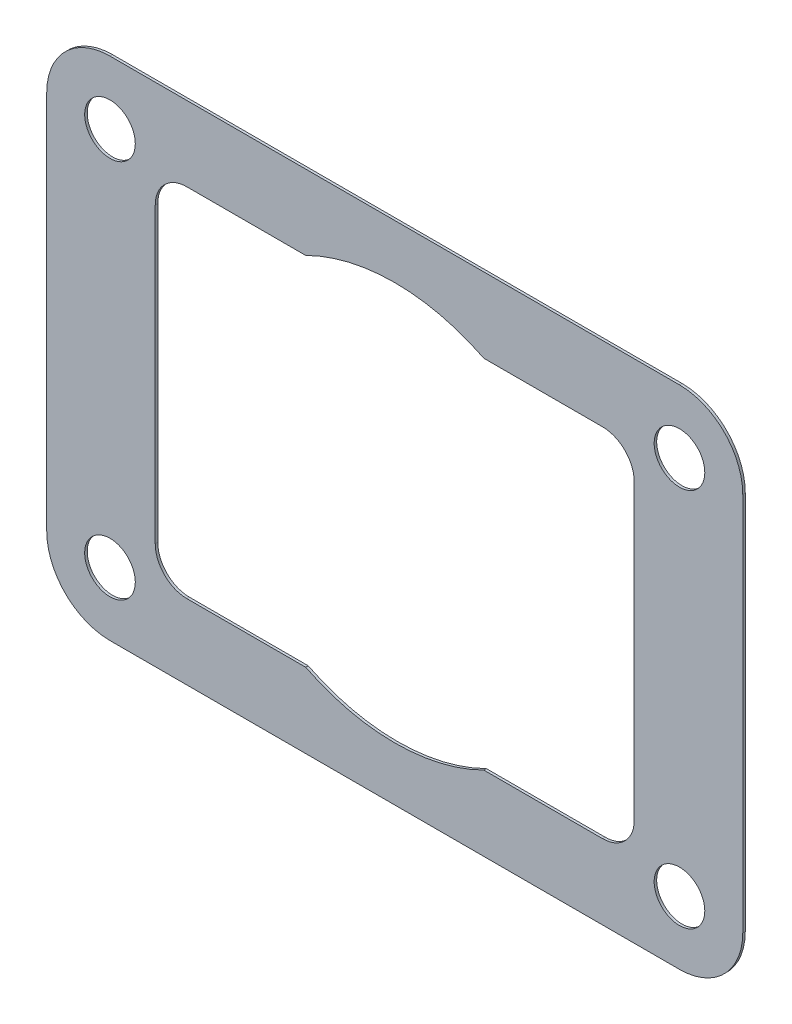
ISO-10303-21;
HEADER;
FILE_DESCRIPTION(('STEP AP214'),'2;1');
FILE_NAME('part.step','',(''),(''),'','','');
FILE_SCHEMA(('AUTOMOTIVE_DESIGN { 1 0 10303 214 1 1 1 1 }'));
ENDSEC;
DATA;
#1=APPLICATION_CONTEXT('core data for automotive mechanical design processes');
#2=APPLICATION_PROTOCOL_DEFINITION('international standard','automotive_design',2000,#1);
#3=PRODUCT_CONTEXT('',#1,'mechanical');
#4=PRODUCT('Part','Part','',(#3));
#5=PRODUCT_RELATED_PRODUCT_CATEGORY('part','',(#4));
#6=PRODUCT_DEFINITION_FORMATION('','',#4);
#7=PRODUCT_DEFINITION_CONTEXT('part definition',#1,'design');
#8=PRODUCT_DEFINITION('design','',#6,#7);
#9=PRODUCT_DEFINITION_SHAPE('','',#8);
#10=(LENGTH_UNIT() NAMED_UNIT(*) SI_UNIT(.MILLI.,.METRE.));
#11=(NAMED_UNIT(*) PLANE_ANGLE_UNIT() SI_UNIT($,.RADIAN.));
#12=(NAMED_UNIT(*) SI_UNIT($,.STERADIAN.) SOLID_ANGLE_UNIT());
#13=UNCERTAINTY_MEASURE_WITH_UNIT(LENGTH_MEASURE(1.E-05),#10,'distance_accuracy_value','');
#14=(GEOMETRIC_REPRESENTATION_CONTEXT(3) GLOBAL_UNCERTAINTY_ASSIGNED_CONTEXT((#13)) GLOBAL_UNIT_ASSIGNED_CONTEXT((#10,
#11,#12)) REPRESENTATION_CONTEXT('',''));
#15=CARTESIAN_POINT('',(0.,0.,0.));
#16=DIRECTION('',(0.,0.,1.));
#17=DIRECTION('',(1.,0.,0.));
#18=AXIS2_PLACEMENT_3D('',#15,#16,#17);
#19=CARTESIAN_POINT('',(-57.15,-38.1,0.508));
#20=DIRECTION('',(0.,0.,-1.));
#21=DIRECTION('',(-1.,0.,0.));
#22=AXIS2_PLACEMENT_3D('',#19,#20,#21);
#23=PLANE('',#22);
#24=CARTESIAN_POINT('',(57.15,38.1,0.508));
#25=DIRECTION('',(0.,0.,1.));
#26=DIRECTION('',(1.,0.,0.));
#27=AXIS2_PLACEMENT_3D('',#24,#25,#26);
#28=CIRCLE('',#27,5.08000000000001);
#29=CARTESIAN_POINT('',(62.23,38.1,0.508));
#30=VERTEX_POINT('',#29);
#31=EDGE_CURVE('E262',#30,#30,#28,.T.);
#32=ORIENTED_EDGE('',*,*,#31,.F.);
#33=EDGE_LOOP('',(#32));
#34=FACE_BOUND('',#33,.T.);
#35=CARTESIAN_POINT('',(-57.15,-38.1,0.508));
#36=DIRECTION('',(0.,0.,1.));
#37=DIRECTION('',(1.,0.,0.));
#38=AXIS2_PLACEMENT_3D('',#35,#36,#37);
#39=CIRCLE('',#38,5.08000000000001);
#40=CARTESIAN_POINT('',(-52.07,-38.1,0.508));
#41=VERTEX_POINT('',#40);
#42=EDGE_CURVE('E274',#41,#41,#39,.T.);
#43=ORIENTED_EDGE('',*,*,#42,.F.);
#44=EDGE_LOOP('',(#43));
#45=FACE_BOUND('',#44,.T.);
#46=CARTESIAN_POINT('',(-57.15,-38.1,0.508));
#47=DIRECTION('',(0.,0.,1.));
#48=DIRECTION('',(-1.,0.,0.));
#49=AXIS2_PLACEMENT_3D('',#46,#47,#48);
#50=CIRCLE('',#49,12.7);
#51=CARTESIAN_POINT('',(-69.85,-38.1,0.508));
#52=VERTEX_POINT('',#51);
#53=CARTESIAN_POINT('',(-57.15,-50.8,0.508));
#54=VERTEX_POINT('',#53);
#55=EDGE_CURVE('E286',#52,#54,#50,.T.);
#56=ORIENTED_EDGE('',*,*,#55,.T.);
#57=DIRECTION('',(1.,0.,0.));
#58=VECTOR('',#57,1.);
#59=CARTESIAN_POINT('',(-57.15,-50.8,0.508));
#60=LINE('',#59,#58);
#61=CARTESIAN_POINT('',(57.15,-50.8,0.508));
#62=VERTEX_POINT('',#61);
#63=EDGE_CURVE('E289',#54,#62,#60,.T.);
#64=ORIENTED_EDGE('',*,*,#63,.T.);
#65=CARTESIAN_POINT('',(57.15,-38.1,0.508));
#66=DIRECTION('',(0.,0.,1.));
#67=DIRECTION('',(1.,0.,0.));
#68=AXIS2_PLACEMENT_3D('',#65,#66,#67);
#69=CIRCLE('',#68,12.7);
#70=CARTESIAN_POINT('',(69.85,-38.1,0.508));
#71=VERTEX_POINT('',#70);
#72=EDGE_CURVE('E292',#62,#71,#69,.T.);
#73=ORIENTED_EDGE('',*,*,#72,.T.);
#74=DIRECTION('',(0.,1.,0.));
#75=VECTOR('',#74,1.);
#76=CARTESIAN_POINT('',(69.85,-38.1,0.508));
#77=LINE('',#76,#75);
#78=CARTESIAN_POINT('',(69.85,38.1,0.508));
#79=VERTEX_POINT('',#78);
#80=EDGE_CURVE('E294',#71,#79,#77,.T.);
#81=ORIENTED_EDGE('',*,*,#80,.T.);
#82=CARTESIAN_POINT('',(57.15,38.1,0.508));
#83=DIRECTION('',(0.,0.,1.));
#84=DIRECTION('',(-1.,0.,0.));
#85=AXIS2_PLACEMENT_3D('',#82,#83,#84);
#86=CIRCLE('',#85,12.7);
#87=CARTESIAN_POINT('',(57.15,50.8,0.508));
#88=VERTEX_POINT('',#87);
#89=EDGE_CURVE('E296',#79,#88,#86,.T.);
#90=ORIENTED_EDGE('',*,*,#89,.T.);
#91=DIRECTION('',(-1.,0.,0.));
#92=VECTOR('',#91,1.);
#93=CARTESIAN_POINT('',(-57.15,50.8,0.508));
#94=LINE('',#93,#92);
#95=CARTESIAN_POINT('',(-57.15,50.8,0.508));
#96=VERTEX_POINT('',#95);
#97=EDGE_CURVE('E298',#88,#96,#94,.T.);
#98=ORIENTED_EDGE('',*,*,#97,.T.);
#99=CARTESIAN_POINT('',(-57.15,38.1,0.508));
#100=DIRECTION('',(0.,0.,1.));
#101=DIRECTION('',(-1.,0.,0.));
#102=AXIS2_PLACEMENT_3D('',#99,#100,#101);
#103=CIRCLE('',#102,12.7);
#104=CARTESIAN_POINT('',(-69.85,38.1,0.508));
#105=VERTEX_POINT('',#104);
#106=EDGE_CURVE('E300',#96,#105,#103,.T.);
#107=ORIENTED_EDGE('',*,*,#106,.T.);
#108=DIRECTION('',(0.,-1.,0.));
#109=VECTOR('',#108,1.);
#110=CARTESIAN_POINT('',(-69.85,-38.1,0.508));
#111=LINE('',#110,#109);
#112=EDGE_CURVE('E302',#105,#52,#111,.T.);
#113=ORIENTED_EDGE('',*,*,#112,.T.);
#114=EDGE_LOOP('',(#56,#64,#73,#81,#90,#98,#107,#113));
#115=FACE_BOUND('',#114,.T.);
#116=CARTESIAN_POINT('',(-57.15,38.1,0.508));
#117=DIRECTION('',(0.,0.,1.));
#118=DIRECTION('',(1.,0.,0.));
#119=AXIS2_PLACEMENT_3D('',#116,#117,#118);
#120=CIRCLE('',#119,5.08000000000001);
#121=CARTESIAN_POINT('',(-52.07,38.1,0.508));
#122=VERTEX_POINT('',#121);
#123=EDGE_CURVE('E280',#122,#122,#120,.T.);
#124=ORIENTED_EDGE('',*,*,#123,.F.);
#125=EDGE_LOOP('',(#124));
#126=FACE_BOUND('',#125,.T.);
#127=CARTESIAN_POINT('',(57.15,-38.1,0.508));
#128=DIRECTION('',(0.,0.,1.));
#129=DIRECTION('',(1.,0.,0.));
#130=AXIS2_PLACEMENT_3D('',#127,#128,#129);
#131=CIRCLE('',#130,5.08000000000001);
#132=CARTESIAN_POINT('',(62.23,-38.1,0.508));
#133=VERTEX_POINT('',#132);
#134=EDGE_CURVE('E268',#133,#133,#131,.T.);
#135=ORIENTED_EDGE('',*,*,#134,.F.);
#136=EDGE_LOOP('',(#135));
#137=FACE_BOUND('',#136,.T.);
#138=CARTESIAN_POINT('',(41.7195,29.4386,0.508));
#139=DIRECTION('',(0.,0.,1.));
#140=DIRECTION('',(-1.,0.,0.));
#141=AXIS2_PLACEMENT_3D('',#138,#139,#140);
#142=CIRCLE('',#141,6.35);
#143=CARTESIAN_POINT('',(48.0695,29.4386,0.508));
#144=VERTEX_POINT('',#143);
#145=CARTESIAN_POINT('',(41.7195,35.7886,0.508));
#146=VERTEX_POINT('',#145);
#147=EDGE_CURVE('E169',#144,#146,#142,.T.);
#148=ORIENTED_EDGE('',*,*,#147,.F.);
#149=DIRECTION('',(0.,1.,0.));
#150=VECTOR('',#149,1.);
#151=CARTESIAN_POINT('',(48.0695,-29.4385999999999,0.508));
#152=LINE('',#151,#150);
#153=CARTESIAN_POINT('',(48.0695,-29.4385999999999,0.508));
#154=VERTEX_POINT('',#153);
#155=EDGE_CURVE('E210',#154,#144,#152,.T.);
#156=ORIENTED_EDGE('',*,*,#155,.F.);
#157=CARTESIAN_POINT('',(41.7195,-29.4386,0.508));
#158=DIRECTION('',(0.,0.,1.));
#159=DIRECTION('',(1.,0.,0.));
#160=AXIS2_PLACEMENT_3D('',#157,#158,#159);
#161=CIRCLE('',#160,6.35);
#162=CARTESIAN_POINT('',(41.7195,-35.7886,0.508));
#163=VERTEX_POINT('',#162);
#164=EDGE_CURVE('E208',#163,#154,#161,.T.);
#165=ORIENTED_EDGE('',*,*,#164,.F.);
#166=DIRECTION('',(1.,0.,0.));
#167=VECTOR('',#166,1.);
#168=CARTESIAN_POINT('',(17.8766925084033,-35.7886,0.508));
#169=LINE('',#168,#167);
#170=CARTESIAN_POINT('',(17.8766925084033,-35.7886,0.508));
#171=VERTEX_POINT('',#170);
#172=EDGE_CURVE('E206',#171,#163,#169,.T.);
#173=ORIENTED_EDGE('',*,*,#172,.F.);
#174=CARTESIAN_POINT('',(0.,0.,0.508));
#175=DIRECTION('',(0.,0.,1.));
#176=DIRECTION('',(1.,0.,0.));
#177=AXIS2_PLACEMENT_3D('',#174,#175,#176);
#178=CIRCLE('',#177,40.005);
#179=CARTESIAN_POINT('',(-17.8766925084033,-35.7886,0.508));
#180=VERTEX_POINT('',#179);
#181=EDGE_CURVE('E204',#180,#171,#178,.T.);
#182=ORIENTED_EDGE('',*,*,#181,.F.);
#183=DIRECTION('',(1.,0.,0.));
#184=VECTOR('',#183,1.);
#185=CARTESIAN_POINT('',(-41.7194999999999,-35.7886,0.508));
#186=LINE('',#185,#184);
#187=CARTESIAN_POINT('',(-41.7194999999999,-35.7886,0.508));
#188=VERTEX_POINT('',#187);
#189=EDGE_CURVE('E202',#188,#180,#186,.T.);
#190=ORIENTED_EDGE('',*,*,#189,.F.);
#191=CARTESIAN_POINT('',(-41.7195,-29.4386,0.508));
#192=DIRECTION('',(0.,0.,1.));
#193=DIRECTION('',(-1.,0.,0.));
#194=AXIS2_PLACEMENT_3D('',#191,#192,#193);
#195=CIRCLE('',#194,6.35);
#196=CARTESIAN_POINT('',(-48.0695,-29.4385999999999,0.508));
#197=VERTEX_POINT('',#196);
#198=EDGE_CURVE('E200',#197,#188,#195,.T.);
#199=ORIENTED_EDGE('',*,*,#198,.F.);
#200=DIRECTION('',(0.,-1.,0.));
#201=VECTOR('',#200,1.);
#202=CARTESIAN_POINT('',(-48.0695,-29.4385999999999,0.508));
#203=LINE('',#202,#201);
#204=CARTESIAN_POINT('',(-48.0695,29.4386,0.508));
#205=VERTEX_POINT('',#204);
#206=EDGE_CURVE('E198',#205,#197,#203,.T.);
#207=ORIENTED_EDGE('',*,*,#206,.F.);
#208=CARTESIAN_POINT('',(-41.7195,29.4386,0.508));
#209=DIRECTION('',(0.,0.,1.));
#210=DIRECTION('',(-1.,0.,0.));
#211=AXIS2_PLACEMENT_3D('',#208,#209,#210);
#212=CIRCLE('',#211,6.35);
#213=CARTESIAN_POINT('',(-41.7194999999999,35.7886,0.508));
#214=VERTEX_POINT('',#213);
#215=EDGE_CURVE('E196',#214,#205,#212,.T.);
#216=ORIENTED_EDGE('',*,*,#215,.F.);
#217=DIRECTION('',(-1.,0.,0.));
#218=VECTOR('',#217,1.);
#219=CARTESIAN_POINT('',(-41.7194999999999,35.7886,0.508));
#220=LINE('',#219,#218);
#221=CARTESIAN_POINT('',(-17.8766925084032,35.7886,0.508));
#222=VERTEX_POINT('',#221);
#223=EDGE_CURVE('E192',#222,#214,#220,.T.);
#224=ORIENTED_EDGE('',*,*,#223,.F.);
#225=CARTESIAN_POINT('',(0.,0.,0.508));
#226=DIRECTION('',(0.,0.,1.));
#227=DIRECTION('',(1.,0.,0.));
#228=AXIS2_PLACEMENT_3D('',#225,#226,#227);
#229=CIRCLE('',#228,40.005);
#230=CARTESIAN_POINT('',(17.8766925084032,35.7886,0.508));
#231=VERTEX_POINT('',#230);
#232=EDGE_CURVE('E190',#231,#222,#229,.T.);
#233=ORIENTED_EDGE('',*,*,#232,.F.);
#234=DIRECTION('',(-1.,0.,0.));
#235=VECTOR('',#234,1.);
#236=CARTESIAN_POINT('',(17.8766925084032,35.7886,0.508));
#237=LINE('',#236,#235);
#238=EDGE_CURVE('E177',#146,#231,#237,.T.);
#239=ORIENTED_EDGE('',*,*,#238,.F.);
#240=EDGE_LOOP('',(#148,#156,#165,#173,#182,#190,#199,#207,#216,#224,#233,#239));
#241=FACE_BOUND('',#240,.T.);
#242=ADVANCED_FACE('F32',(#34,#45,#115,#126,#137,#241),#23,.F.);
#243=CARTESIAN_POINT('',(-57.15,-38.1,0.));
#244=DIRECTION('',(0.,0.,-1.));
#245=DIRECTION('',(-1.,0.,0.));
#246=AXIS2_PLACEMENT_3D('',#243,#244,#245);
#247=PLANE('',#246);
#248=CARTESIAN_POINT('',(57.15,38.1,0.));
#249=DIRECTION('',(0.,0.,1.));
#250=DIRECTION('',(1.,0.,0.));
#251=AXIS2_PLACEMENT_3D('',#248,#249,#250);
#252=CIRCLE('',#251,5.08000000000001);
#253=CARTESIAN_POINT('',(62.23,38.1,0.));
#254=VERTEX_POINT('',#253);
#255=EDGE_CURVE('E185',#254,#254,#252,.T.);
#256=ORIENTED_EDGE('',*,*,#255,.T.);
#257=EDGE_LOOP('',(#256));
#258=FACE_BOUND('',#257,.T.);
#259=CARTESIAN_POINT('',(-57.15,-38.1,0.));
#260=DIRECTION('',(0.,0.,1.));
#261=DIRECTION('',(1.,0.,0.));
#262=AXIS2_PLACEMENT_3D('',#259,#260,#261);
#263=CIRCLE('',#262,5.08000000000001);
#264=CARTESIAN_POINT('',(-52.07,-38.1,0.));
#265=VERTEX_POINT('',#264);
#266=EDGE_CURVE('E271',#265,#265,#263,.T.);
#267=ORIENTED_EDGE('',*,*,#266,.T.);
#268=EDGE_LOOP('',(#267));
#269=FACE_BOUND('',#268,.T.);
#270=CARTESIAN_POINT('',(-57.15,-38.1,0.));
#271=DIRECTION('',(0.,0.,1.));
#272=DIRECTION('',(-1.,0.,0.));
#273=AXIS2_PLACEMENT_3D('',#270,#271,#272);
#274=CIRCLE('',#273,12.7);
#275=CARTESIAN_POINT('',(-69.85,-38.1,0.));
#276=VERTEX_POINT('',#275);
#277=CARTESIAN_POINT('',(-57.15,-50.8,0.));
#278=VERTEX_POINT('',#277);
#279=EDGE_CURVE('E283',#276,#278,#274,.T.);
#280=ORIENTED_EDGE('',*,*,#279,.F.);
#281=DIRECTION('',(0.,-1.,0.));
#282=VECTOR('',#281,1.);
#283=CARTESIAN_POINT('',(-69.85,-38.1,0.));
#284=LINE('',#283,#282);
#285=CARTESIAN_POINT('',(-69.85,38.1,0.));
#286=VERTEX_POINT('',#285);
#287=EDGE_CURVE('E290',#286,#276,#284,.T.);
#288=ORIENTED_EDGE('',*,*,#287,.F.);
#289=CARTESIAN_POINT('',(-57.15,38.1,0.));
#290=DIRECTION('',(0.,0.,1.));
#291=DIRECTION('',(-1.,0.,0.));
#292=AXIS2_PLACEMENT_3D('',#289,#290,#291);
#293=CIRCLE('',#292,12.7);
#294=CARTESIAN_POINT('',(-57.15,50.8,0.));
#295=VERTEX_POINT('',#294);
#296=EDGE_CURVE('E317',#295,#286,#293,.T.);
#297=ORIENTED_EDGE('',*,*,#296,.F.);
#298=DIRECTION('',(-1.,0.,0.));
#299=VECTOR('',#298,1.);
#300=CARTESIAN_POINT('',(-57.15,50.8,0.));
#301=LINE('',#300,#299);
#302=CARTESIAN_POINT('',(57.15,50.8,0.));
#303=VERTEX_POINT('',#302);
#304=EDGE_CURVE('E315',#303,#295,#301,.T.);
#305=ORIENTED_EDGE('',*,*,#304,.F.);
#306=CARTESIAN_POINT('',(57.15,38.1,0.));
#307=DIRECTION('',(0.,0.,1.));
#308=DIRECTION('',(-1.,0.,0.));
#309=AXIS2_PLACEMENT_3D('',#306,#307,#308);
#310=CIRCLE('',#309,12.7);
#311=CARTESIAN_POINT('',(69.85,38.1,0.));
#312=VERTEX_POINT('',#311);
#313=EDGE_CURVE('E313',#312,#303,#310,.T.);
#314=ORIENTED_EDGE('',*,*,#313,.F.);
#315=DIRECTION('',(0.,1.,0.));
#316=VECTOR('',#315,1.);
#317=CARTESIAN_POINT('',(69.85,-38.1,0.));
#318=LINE('',#317,#316);
#319=CARTESIAN_POINT('',(69.85,-38.1,0.));
#320=VERTEX_POINT('',#319);
#321=EDGE_CURVE('E311',#320,#312,#318,.T.);
#322=ORIENTED_EDGE('',*,*,#321,.F.);
#323=CARTESIAN_POINT('',(57.15,-38.1,0.));
#324=DIRECTION('',(0.,0.,1.));
#325=DIRECTION('',(1.,0.,0.));
#326=AXIS2_PLACEMENT_3D('',#323,#324,#325);
#327=CIRCLE('',#326,12.7);
#328=CARTESIAN_POINT('',(57.15,-50.8,0.));
#329=VERTEX_POINT('',#328);
#330=EDGE_CURVE('E309',#329,#320,#327,.T.);
#331=ORIENTED_EDGE('',*,*,#330,.F.);
#332=DIRECTION('',(1.,0.,0.));
#333=VECTOR('',#332,1.);
#334=CARTESIAN_POINT('',(-57.15,-50.8,0.));
#335=LINE('',#334,#333);
#336=EDGE_CURVE('E307',#278,#329,#335,.T.);
#337=ORIENTED_EDGE('',*,*,#336,.F.);
#338=EDGE_LOOP('',(#280,#288,#297,#305,#314,#322,#331,#337));
#339=FACE_BOUND('',#338,.T.);
#340=CARTESIAN_POINT('',(-57.15,38.1,0.));
#341=DIRECTION('',(0.,0.,1.));
#342=DIRECTION('',(1.,0.,0.));
#343=AXIS2_PLACEMENT_3D('',#340,#341,#342);
#344=CIRCLE('',#343,5.08000000000001);
#345=CARTESIAN_POINT('',(-52.07,38.1,0.));
#346=VERTEX_POINT('',#345);
#347=EDGE_CURVE('E277',#346,#346,#344,.T.);
#348=ORIENTED_EDGE('',*,*,#347,.T.);
#349=EDGE_LOOP('',(#348));
#350=FACE_BOUND('',#349,.T.);
#351=CARTESIAN_POINT('',(57.15,-38.1,0.));
#352=DIRECTION('',(0.,0.,1.));
#353=DIRECTION('',(1.,0.,0.));
#354=AXIS2_PLACEMENT_3D('',#351,#352,#353);
#355=CIRCLE('',#354,5.08000000000001);
#356=CARTESIAN_POINT('',(62.23,-38.1,0.));
#357=VERTEX_POINT('',#356);
#358=EDGE_CURVE('E265',#357,#357,#355,.T.);
#359=ORIENTED_EDGE('',*,*,#358,.T.);
#360=EDGE_LOOP('',(#359));
#361=FACE_BOUND('',#360,.T.);
#362=DIRECTION('',(0.,1.,0.));
#363=VECTOR('',#362,1.);
#364=CARTESIAN_POINT('',(48.0695,-29.4385999999999,0.));
#365=LINE('',#364,#363);
#366=CARTESIAN_POINT('',(48.0695,-29.4385999999999,0.));
#367=VERTEX_POINT('',#366);
#368=CARTESIAN_POINT('',(48.0695,29.4386,0.));
#369=VERTEX_POINT('',#368);
#370=EDGE_CURVE('E178',#367,#369,#365,.T.);
#371=ORIENTED_EDGE('',*,*,#370,.T.);
#372=CARTESIAN_POINT('',(41.7195,29.4386,0.));
#373=DIRECTION('',(0.,0.,1.));
#374=DIRECTION('',(-1.,0.,0.));
#375=AXIS2_PLACEMENT_3D('',#372,#373,#374);
#376=CIRCLE('',#375,6.35);
#377=CARTESIAN_POINT('',(41.7195,35.7886,0.));
#378=VERTEX_POINT('',#377);
#379=EDGE_CURVE('E55',#369,#378,#376,.T.);
#380=ORIENTED_EDGE('',*,*,#379,.T.);
#381=DIRECTION('',(-1.,0.,0.));
#382=VECTOR('',#381,1.);
#383=CARTESIAN_POINT('',(17.8766925084032,35.7886,0.));
#384=LINE('',#383,#382);
#385=CARTESIAN_POINT('',(17.8766925084032,35.7886,0.));
#386=VERTEX_POINT('',#385);
#387=EDGE_CURVE('E184',#378,#386,#384,.T.);
#388=ORIENTED_EDGE('',*,*,#387,.T.);
#389=CARTESIAN_POINT('',(0.,0.,0.));
#390=DIRECTION('',(0.,0.,1.));
#391=DIRECTION('',(1.,0.,0.));
#392=AXIS2_PLACEMENT_3D('',#389,#390,#391);
#393=CIRCLE('',#392,40.005);
#394=CARTESIAN_POINT('',(-17.8766925084032,35.7886,0.));
#395=VERTEX_POINT('',#394);
#396=EDGE_CURVE('E214',#386,#395,#393,.T.);
#397=ORIENTED_EDGE('',*,*,#396,.T.);
#398=DIRECTION('',(-1.,0.,0.));
#399=VECTOR('',#398,1.);
#400=CARTESIAN_POINT('',(-41.7194999999999,35.7886,0.));
#401=LINE('',#400,#399);
#402=CARTESIAN_POINT('',(-41.7194999999999,35.7886,0.));
#403=VERTEX_POINT('',#402);
#404=EDGE_CURVE('E217',#395,#403,#401,.T.);
#405=ORIENTED_EDGE('',*,*,#404,.T.);
#406=CARTESIAN_POINT('',(-41.7195,29.4386,0.));
#407=DIRECTION('',(0.,0.,1.));
#408=DIRECTION('',(-1.,0.,0.));
#409=AXIS2_PLACEMENT_3D('',#406,#407,#408);
#410=CIRCLE('',#409,6.35);
#411=CARTESIAN_POINT('',(-48.0695,29.4386,0.));
#412=VERTEX_POINT('',#411);
#413=EDGE_CURVE('E220',#403,#412,#410,.T.);
#414=ORIENTED_EDGE('',*,*,#413,.T.);
#415=DIRECTION('',(0.,-1.,0.));
#416=VECTOR('',#415,1.);
#417=CARTESIAN_POINT('',(-48.0695,-29.4385999999999,0.));
#418=LINE('',#417,#416);
#419=CARTESIAN_POINT('',(-48.0695,-29.4385999999999,0.));
#420=VERTEX_POINT('',#419);
#421=EDGE_CURVE('E223',#412,#420,#418,.T.);
#422=ORIENTED_EDGE('',*,*,#421,.T.);
#423=CARTESIAN_POINT('',(-41.7195,-29.4386,0.));
#424=DIRECTION('',(0.,0.,1.));
#425=DIRECTION('',(-1.,0.,0.));
#426=AXIS2_PLACEMENT_3D('',#423,#424,#425);
#427=CIRCLE('',#426,6.35);
#428=CARTESIAN_POINT('',(-41.7194999999999,-35.7886,0.));
#429=VERTEX_POINT('',#428);
#430=EDGE_CURVE('E226',#420,#429,#427,.T.);
#431=ORIENTED_EDGE('',*,*,#430,.T.);
#432=DIRECTION('',(1.,0.,0.));
#433=VECTOR('',#432,1.);
#434=CARTESIAN_POINT('',(-41.7194999999999,-35.7886,0.));
#435=LINE('',#434,#433);
#436=CARTESIAN_POINT('',(-17.8766925084033,-35.7886,0.));
#437=VERTEX_POINT('',#436);
#438=EDGE_CURVE('E229',#429,#437,#435,.T.);
#439=ORIENTED_EDGE('',*,*,#438,.T.);
#440=CARTESIAN_POINT('',(0.,0.,0.));
#441=DIRECTION('',(0.,0.,1.));
#442=DIRECTION('',(1.,0.,0.));
#443=AXIS2_PLACEMENT_3D('',#440,#441,#442);
#444=CIRCLE('',#443,40.005);
#445=CARTESIAN_POINT('',(17.8766925084033,-35.7886,0.));
#446=VERTEX_POINT('',#445);
#447=EDGE_CURVE('E232',#437,#446,#444,.T.);
#448=ORIENTED_EDGE('',*,*,#447,.T.);
#449=DIRECTION('',(1.,0.,0.));
#450=VECTOR('',#449,1.);
#451=CARTESIAN_POINT('',(17.8766925084033,-35.7886,0.));
#452=LINE('',#451,#450);
#453=CARTESIAN_POINT('',(41.7195,-35.7886,0.));
#454=VERTEX_POINT('',#453);
#455=EDGE_CURVE('E235',#446,#454,#452,.T.);
#456=ORIENTED_EDGE('',*,*,#455,.T.);
#457=CARTESIAN_POINT('',(41.7195,-29.4386,0.));
#458=DIRECTION('',(0.,0.,1.));
#459=DIRECTION('',(1.,0.,0.));
#460=AXIS2_PLACEMENT_3D('',#457,#458,#459);
#461=CIRCLE('',#460,6.35);
#462=EDGE_CURVE('E238',#454,#367,#461,.T.);
#463=ORIENTED_EDGE('',*,*,#462,.T.);
#464=EDGE_LOOP('',(#371,#380,#388,#397,#405,#414,#422,#431,#439,#448,#456,#463));
#465=FACE_BOUND('',#464,.T.);
#466=ADVANCED_FACE('F347',(#258,#269,#339,#350,#361,#465),#247,.T.);
#467=CARTESIAN_POINT('',(-57.15,-38.1,0.508));
#468=DIRECTION('',(0.,0.,-1.));
#469=DIRECTION('',(-1.,0.,0.));
#470=AXIS2_PLACEMENT_3D('',#467,#468,#469);
#471=CYLINDRICAL_SURFACE('',#470,12.7);
#472=ORIENTED_EDGE('',*,*,#279,.T.);
#473=DIRECTION('',(0.,0.,-1.));
#474=VECTOR('',#473,1.);
#475=CARTESIAN_POINT('',(-57.15,-50.8,0.508));
#476=LINE('',#475,#474);
#477=EDGE_CURVE('E11',#54,#278,#476,.T.);
#478=ORIENTED_EDGE('',*,*,#477,.F.);
#479=ORIENTED_EDGE('',*,*,#55,.F.);
#480=DIRECTION('',(0.,0.,-1.));
#481=VECTOR('',#480,1.);
#482=CARTESIAN_POINT('',(-69.85,-38.1,0.508));
#483=LINE('',#482,#481);
#484=EDGE_CURVE('E304',#52,#276,#483,.T.);
#485=ORIENTED_EDGE('',*,*,#484,.T.);
#486=EDGE_LOOP('',(#472,#478,#479,#485));
#487=FACE_BOUND('',#486,.T.);
#488=ADVANCED_FACE('F34',(#487),#471,.T.);
#489=CARTESIAN_POINT('',(-57.15,-50.8,0.508));
#490=DIRECTION('',(0.,1.,0.));
#491=DIRECTION('',(0.,0.,1.));
#492=AXIS2_PLACEMENT_3D('',#489,#490,#491);
#493=PLANE('',#492);
#494=ORIENTED_EDGE('',*,*,#336,.T.);
#495=DIRECTION('',(0.,0.,-1.));
#496=VECTOR('',#495,1.);
#497=CARTESIAN_POINT('',(57.15,-50.8,0.508));
#498=LINE('',#497,#496);
#499=EDGE_CURVE('E40',#62,#329,#498,.T.);
#500=ORIENTED_EDGE('',*,*,#499,.F.);
#501=ORIENTED_EDGE('',*,*,#63,.F.);
#502=ORIENTED_EDGE('',*,*,#477,.T.);
#503=EDGE_LOOP('',(#494,#500,#501,#502));
#504=FACE_BOUND('',#503,.T.);
#505=ADVANCED_FACE('F365',(#504),#493,.F.);
#506=CARTESIAN_POINT('',(57.15,-38.1,0.508));
#507=DIRECTION('',(0.,0.,-1.));
#508=DIRECTION('',(-1.,0.,0.));
#509=AXIS2_PLACEMENT_3D('',#506,#507,#508);
#510=CYLINDRICAL_SURFACE('',#509,12.7);
#511=ORIENTED_EDGE('',*,*,#330,.T.);
#512=DIRECTION('',(0.,0.,-1.));
#513=VECTOR('',#512,1.);
#514=CARTESIAN_POINT('',(69.85,-38.1,0.508));
#515=LINE('',#514,#513);
#516=EDGE_CURVE('E334',#71,#320,#515,.T.);
#517=ORIENTED_EDGE('',*,*,#516,.F.);
#518=ORIENTED_EDGE('',*,*,#72,.F.);
#519=ORIENTED_EDGE('',*,*,#499,.T.);
#520=EDGE_LOOP('',(#511,#517,#518,#519));
#521=FACE_BOUND('',#520,.T.);
#522=ADVANCED_FACE('F341',(#521),#510,.T.);
#523=CARTESIAN_POINT('',(69.85,-38.1,0.508));
#524=DIRECTION('',(-1.,0.,0.));
#525=DIRECTION('',(0.,0.,1.));
#526=AXIS2_PLACEMENT_3D('',#523,#524,#525);
#527=PLANE('',#526);
#528=ORIENTED_EDGE('',*,*,#321,.T.);
#529=DIRECTION('',(0.,0.,-1.));
#530=VECTOR('',#529,1.);
#531=CARTESIAN_POINT('',(69.85,38.1,0.508));
#532=LINE('',#531,#530);
#533=EDGE_CURVE('E331',#79,#312,#532,.T.);
#534=ORIENTED_EDGE('',*,*,#533,.F.);
#535=ORIENTED_EDGE('',*,*,#80,.F.);
#536=ORIENTED_EDGE('',*,*,#516,.T.);
#537=EDGE_LOOP('',(#528,#534,#535,#536));
#538=FACE_BOUND('',#537,.T.);
#539=ADVANCED_FACE('F353',(#538),#527,.F.);
#540=CARTESIAN_POINT('',(57.15,38.1,0.508));
#541=DIRECTION('',(0.,0.,-1.));
#542=DIRECTION('',(-1.,0.,0.));
#543=AXIS2_PLACEMENT_3D('',#540,#541,#542);
#544=CYLINDRICAL_SURFACE('',#543,12.7);
#545=ORIENTED_EDGE('',*,*,#313,.T.);
#546=DIRECTION('',(0.,0.,-1.));
#547=VECTOR('',#546,1.);
#548=CARTESIAN_POINT('',(57.15,50.8,0.508));
#549=LINE('',#548,#547);
#550=EDGE_CURVE('E328',#88,#303,#549,.T.);
#551=ORIENTED_EDGE('',*,*,#550,.F.);
#552=ORIENTED_EDGE('',*,*,#89,.F.);
#553=ORIENTED_EDGE('',*,*,#533,.T.);
#554=EDGE_LOOP('',(#545,#551,#552,#553));
#555=FACE_BOUND('',#554,.T.);
#556=ADVANCED_FACE('F357',(#555),#544,.T.);
#557=CARTESIAN_POINT('',(-57.15,50.8,0.508));
#558=DIRECTION('',(0.,-1.,0.));
#559=DIRECTION('',(0.,0.,-1.));
#560=AXIS2_PLACEMENT_3D('',#557,#558,#559);
#561=PLANE('',#560);
#562=ORIENTED_EDGE('',*,*,#304,.T.);
#563=DIRECTION('',(0.,0.,-1.));
#564=VECTOR('',#563,1.);
#565=CARTESIAN_POINT('',(-57.15,50.8,0.508));
#566=LINE('',#565,#564);
#567=EDGE_CURVE('E325',#96,#295,#566,.T.);
#568=ORIENTED_EDGE('',*,*,#567,.F.);
#569=ORIENTED_EDGE('',*,*,#97,.F.);
#570=ORIENTED_EDGE('',*,*,#550,.T.);
#571=EDGE_LOOP('',(#562,#568,#569,#570));
#572=FACE_BOUND('',#571,.T.);
#573=ADVANCED_FACE('F378',(#572),#561,.F.);
#574=CARTESIAN_POINT('',(-57.15,38.1,0.508));
#575=DIRECTION('',(0.,0.,-1.));
#576=DIRECTION('',(-1.,0.,0.));
#577=AXIS2_PLACEMENT_3D('',#574,#575,#576);
#578=CYLINDRICAL_SURFACE('',#577,12.7);
#579=ORIENTED_EDGE('',*,*,#296,.T.);
#580=DIRECTION('',(0.,0.,-1.));
#581=VECTOR('',#580,1.);
#582=CARTESIAN_POINT('',(-69.85,38.1,0.508));
#583=LINE('',#582,#581);
#584=EDGE_CURVE('E322',#105,#286,#583,.T.);
#585=ORIENTED_EDGE('',*,*,#584,.F.);
#586=ORIENTED_EDGE('',*,*,#106,.F.);
#587=ORIENTED_EDGE('',*,*,#567,.T.);
#588=EDGE_LOOP('',(#579,#585,#586,#587));
#589=FACE_BOUND('',#588,.T.);
#590=ADVANCED_FACE('F376',(#589),#578,.T.);
#591=CARTESIAN_POINT('',(-69.85,-38.1,0.508));
#592=DIRECTION('',(1.,0.,0.));
#593=DIRECTION('',(0.,0.,-1.));
#594=AXIS2_PLACEMENT_3D('',#591,#592,#593);
#595=PLANE('',#594);
#596=ORIENTED_EDGE('',*,*,#287,.T.);
#597=ORIENTED_EDGE('',*,*,#484,.F.);
#598=ORIENTED_EDGE('',*,*,#112,.F.);
#599=ORIENTED_EDGE('',*,*,#584,.T.);
#600=EDGE_LOOP('',(#596,#597,#598,#599));
#601=FACE_BOUND('',#600,.T.);
#602=ADVANCED_FACE('F371',(#601),#595,.F.);
#603=CARTESIAN_POINT('',(-57.15,38.1,0.508));
#604=DIRECTION('',(0.,0.,-1.));
#605=DIRECTION('',(-1.,0.,0.));
#606=AXIS2_PLACEMENT_3D('',#603,#604,#605);
#607=CYLINDRICAL_SURFACE('',#606,5.08000000000001);
#608=ORIENTED_EDGE('',*,*,#123,.T.);
#609=EDGE_LOOP('',(#608));
#610=FACE_BOUND('',#609,.T.);
#611=ORIENTED_EDGE('',*,*,#347,.F.);
#612=EDGE_LOOP('',(#611));
#613=FACE_BOUND('',#612,.T.);
#614=ADVANCED_FACE('F398',(#610,#613),#607,.F.);
#615=CARTESIAN_POINT('',(-57.15,-38.1,0.508));
#616=DIRECTION('',(0.,0.,-1.));
#617=DIRECTION('',(-1.,0.,0.));
#618=AXIS2_PLACEMENT_3D('',#615,#616,#617);
#619=CYLINDRICAL_SURFACE('',#618,5.08000000000001);
#620=ORIENTED_EDGE('',*,*,#42,.T.);
#621=EDGE_LOOP('',(#620));
#622=FACE_BOUND('',#621,.T.);
#623=ORIENTED_EDGE('',*,*,#266,.F.);
#624=EDGE_LOOP('',(#623));
#625=FACE_BOUND('',#624,.T.);
#626=ADVANCED_FACE('F405',(#622,#625),#619,.F.);
#627=CARTESIAN_POINT('',(57.15,-38.1,0.508));
#628=DIRECTION('',(0.,0.,-1.));
#629=DIRECTION('',(-1.,0.,0.));
#630=AXIS2_PLACEMENT_3D('',#627,#628,#629);
#631=CYLINDRICAL_SURFACE('',#630,5.08000000000001);
#632=ORIENTED_EDGE('',*,*,#134,.T.);
#633=EDGE_LOOP('',(#632));
#634=FACE_BOUND('',#633,.T.);
#635=ORIENTED_EDGE('',*,*,#358,.F.);
#636=EDGE_LOOP('',(#635));
#637=FACE_BOUND('',#636,.T.);
#638=ADVANCED_FACE('F410',(#634,#637),#631,.F.);
#639=CARTESIAN_POINT('',(57.15,38.1,0.508));
#640=DIRECTION('',(0.,0.,-1.));
#641=DIRECTION('',(-1.,0.,0.));
#642=AXIS2_PLACEMENT_3D('',#639,#640,#641);
#643=CYLINDRICAL_SURFACE('',#642,5.08000000000001);
#644=ORIENTED_EDGE('',*,*,#31,.T.);
#645=EDGE_LOOP('',(#644));
#646=FACE_BOUND('',#645,.T.);
#647=ORIENTED_EDGE('',*,*,#255,.F.);
#648=EDGE_LOOP('',(#647));
#649=FACE_BOUND('',#648,.T.);
#650=ADVANCED_FACE('F473',(#646,#649),#643,.F.);
#651=CARTESIAN_POINT('',(41.7195,29.4386,0.508));
#652=DIRECTION('',(0.,0.,-1.));
#653=DIRECTION('',(-1.,0.,0.));
#654=AXIS2_PLACEMENT_3D('',#651,#652,#653);
#655=CYLINDRICAL_SURFACE('',#654,6.35);
#656=ORIENTED_EDGE('',*,*,#379,.F.);
#657=DIRECTION('',(0.,0.,-1.));
#658=VECTOR('',#657,1.);
#659=CARTESIAN_POINT('',(48.0695,29.4386,0.508));
#660=LINE('',#659,#658);
#661=EDGE_CURVE('E173',#144,#369,#660,.T.);
#662=ORIENTED_EDGE('',*,*,#661,.F.);
#663=ORIENTED_EDGE('',*,*,#147,.T.);
#664=DIRECTION('',(0.,0.,-1.));
#665=VECTOR('',#664,1.);
#666=CARTESIAN_POINT('',(41.7195,35.7886,0.508));
#667=LINE('',#666,#665);
#668=EDGE_CURVE('E172',#146,#378,#667,.T.);
#669=ORIENTED_EDGE('',*,*,#668,.T.);
#670=EDGE_LOOP('',(#656,#662,#663,#669));
#671=FACE_BOUND('',#670,.T.);
#672=ADVANCED_FACE('F171',(#671),#655,.F.);
#673=CARTESIAN_POINT('',(17.8766925084032,35.7886,0.508));
#674=DIRECTION('',(0.,-1.,0.));
#675=DIRECTION('',(0.,0.,-1.));
#676=AXIS2_PLACEMENT_3D('',#673,#674,#675);
#677=PLANE('',#676);
#678=ORIENTED_EDGE('',*,*,#387,.F.);
#679=ORIENTED_EDGE('',*,*,#668,.F.);
#680=ORIENTED_EDGE('',*,*,#238,.T.);
#681=DIRECTION('',(0.,0.,-1.));
#682=VECTOR('',#681,1.);
#683=CARTESIAN_POINT('',(17.8766925084032,35.7886,0.508));
#684=LINE('',#683,#682);
#685=EDGE_CURVE('E186',#231,#386,#684,.T.);
#686=ORIENTED_EDGE('',*,*,#685,.T.);
#687=EDGE_LOOP('',(#678,#679,#680,#686));
#688=FACE_BOUND('',#687,.T.);
#689=ADVANCED_FACE('F181',(#688),#677,.T.);
#690=CARTESIAN_POINT('',(0.,0.,0.508));
#691=DIRECTION('',(0.,0.,-1.));
#692=DIRECTION('',(-1.,0.,0.));
#693=AXIS2_PLACEMENT_3D('',#690,#691,#692);
#694=CYLINDRICAL_SURFACE('',#693,40.005);
#695=ORIENTED_EDGE('',*,*,#396,.F.);
#696=ORIENTED_EDGE('',*,*,#685,.F.);
#697=ORIENTED_EDGE('',*,*,#232,.T.);
#698=DIRECTION('',(0.,0.,-1.));
#699=VECTOR('',#698,1.);
#700=CARTESIAN_POINT('',(-17.8766925084032,35.7886,0.508));
#701=LINE('',#700,#699);
#702=EDGE_CURVE('E259',#222,#395,#701,.T.);
#703=ORIENTED_EDGE('',*,*,#702,.T.);
#704=EDGE_LOOP('',(#695,#696,#697,#703));
#705=FACE_BOUND('',#704,.T.);
#706=ADVANCED_FACE('F460',(#705),#694,.F.);
#707=CARTESIAN_POINT('',(-41.7194999999999,35.7886,0.508));
#708=DIRECTION('',(0.,-1.,0.));
#709=DIRECTION('',(0.,0.,-1.));
#710=AXIS2_PLACEMENT_3D('',#707,#708,#709);
#711=PLANE('',#710);
#712=ORIENTED_EDGE('',*,*,#404,.F.);
#713=ORIENTED_EDGE('',*,*,#702,.F.);
#714=ORIENTED_EDGE('',*,*,#223,.T.);
#715=DIRECTION('',(0.,0.,-1.));
#716=VECTOR('',#715,1.);
#717=CARTESIAN_POINT('',(-41.7194999999999,35.7886,0.508));
#718=LINE('',#717,#716);
#719=EDGE_CURVE('E257',#214,#403,#718,.T.);
#720=ORIENTED_EDGE('',*,*,#719,.T.);
#721=EDGE_LOOP('',(#712,#713,#714,#720));
#722=FACE_BOUND('',#721,.T.);
#723=ADVANCED_FACE('F456',(#722),#711,.T.);
#724=CARTESIAN_POINT('',(-41.7195,29.4386,0.508));
#725=DIRECTION('',(0.,0.,-1.));
#726=DIRECTION('',(-1.,0.,0.));
#727=AXIS2_PLACEMENT_3D('',#724,#725,#726);
#728=CYLINDRICAL_SURFACE('',#727,6.35);
#729=ORIENTED_EDGE('',*,*,#413,.F.);
#730=ORIENTED_EDGE('',*,*,#719,.F.);
#731=ORIENTED_EDGE('',*,*,#215,.T.);
#732=DIRECTION('',(0.,0.,-1.));
#733=VECTOR('',#732,1.);
#734=CARTESIAN_POINT('',(-48.0695,29.4386,0.508));
#735=LINE('',#734,#733);
#736=EDGE_CURVE('E255',#205,#412,#735,.T.);
#737=ORIENTED_EDGE('',*,*,#736,.T.);
#738=EDGE_LOOP('',(#729,#730,#731,#737));
#739=FACE_BOUND('',#738,.T.);
#740=ADVANCED_FACE('F453',(#739),#728,.F.);
#741=CARTESIAN_POINT('',(-48.0695,-29.4385999999999,0.508));
#742=DIRECTION('',(1.,0.,0.));
#743=DIRECTION('',(0.,0.,-1.));
#744=AXIS2_PLACEMENT_3D('',#741,#742,#743);
#745=PLANE('',#744);
#746=ORIENTED_EDGE('',*,*,#421,.F.);
#747=ORIENTED_EDGE('',*,*,#736,.F.);
#748=ORIENTED_EDGE('',*,*,#206,.T.);
#749=DIRECTION('',(0.,0.,-1.));
#750=VECTOR('',#749,1.);
#751=CARTESIAN_POINT('',(-48.0695,-29.4385999999999,0.508));
#752=LINE('',#751,#750);
#753=EDGE_CURVE('E253',#197,#420,#752,.T.);
#754=ORIENTED_EDGE('',*,*,#753,.T.);
#755=EDGE_LOOP('',(#746,#747,#748,#754));
#756=FACE_BOUND('',#755,.T.);
#757=ADVANCED_FACE('F447',(#756),#745,.T.);
#758=CARTESIAN_POINT('',(-41.7195,-29.4386,0.508));
#759=DIRECTION('',(0.,0.,-1.));
#760=DIRECTION('',(-1.,0.,0.));
#761=AXIS2_PLACEMENT_3D('',#758,#759,#760);
#762=CYLINDRICAL_SURFACE('',#761,6.35);
#763=ORIENTED_EDGE('',*,*,#430,.F.);
#764=ORIENTED_EDGE('',*,*,#753,.F.);
#765=ORIENTED_EDGE('',*,*,#198,.T.);
#766=DIRECTION('',(0.,0.,-1.));
#767=VECTOR('',#766,1.);
#768=CARTESIAN_POINT('',(-41.7194999999999,-35.7886,0.508));
#769=LINE('',#768,#767);
#770=EDGE_CURVE('E251',#188,#429,#769,.T.);
#771=ORIENTED_EDGE('',*,*,#770,.T.);
#772=EDGE_LOOP('',(#763,#764,#765,#771));
#773=FACE_BOUND('',#772,.T.);
#774=ADVANCED_FACE('F443',(#773),#762,.F.);
#775=CARTESIAN_POINT('',(-41.7194999999999,-35.7886,0.508));
#776=DIRECTION('',(0.,1.,0.));
#777=DIRECTION('',(0.,0.,1.));
#778=AXIS2_PLACEMENT_3D('',#775,#776,#777);
#779=PLANE('',#778);
#780=ORIENTED_EDGE('',*,*,#438,.F.);
#781=ORIENTED_EDGE('',*,*,#770,.F.);
#782=ORIENTED_EDGE('',*,*,#189,.T.);
#783=DIRECTION('',(0.,0.,-1.));
#784=VECTOR('',#783,1.);
#785=CARTESIAN_POINT('',(-17.8766925084033,-35.7886,0.508));
#786=LINE('',#785,#784);
#787=EDGE_CURVE('E249',#180,#437,#786,.T.);
#788=ORIENTED_EDGE('',*,*,#787,.T.);
#789=EDGE_LOOP('',(#780,#781,#782,#788));
#790=FACE_BOUND('',#789,.T.);
#791=ADVANCED_FACE('F440',(#790),#779,.T.);
#792=CARTESIAN_POINT('',(0.,0.,0.508));
#793=DIRECTION('',(0.,0.,-1.));
#794=DIRECTION('',(-1.,0.,0.));
#795=AXIS2_PLACEMENT_3D('',#792,#793,#794);
#796=CYLINDRICAL_SURFACE('',#795,40.005);
#797=ORIENTED_EDGE('',*,*,#447,.F.);
#798=ORIENTED_EDGE('',*,*,#787,.F.);
#799=ORIENTED_EDGE('',*,*,#181,.T.);
#800=DIRECTION('',(0.,0.,-1.));
#801=VECTOR('',#800,1.);
#802=CARTESIAN_POINT('',(17.8766925084033,-35.7886,0.508));
#803=LINE('',#802,#801);
#804=EDGE_CURVE('E247',#171,#446,#803,.T.);
#805=ORIENTED_EDGE('',*,*,#804,.T.);
#806=EDGE_LOOP('',(#797,#798,#799,#805));
#807=FACE_BOUND('',#806,.T.);
#808=ADVANCED_FACE('F432',(#807),#796,.F.);
#809=CARTESIAN_POINT('',(17.8766925084033,-35.7886,0.508));
#810=DIRECTION('',(0.,1.,0.));
#811=DIRECTION('',(0.,0.,1.));
#812=AXIS2_PLACEMENT_3D('',#809,#810,#811);
#813=PLANE('',#812);
#814=ORIENTED_EDGE('',*,*,#455,.F.);
#815=ORIENTED_EDGE('',*,*,#804,.F.);
#816=ORIENTED_EDGE('',*,*,#172,.T.);
#817=DIRECTION('',(0.,0.,-1.));
#818=VECTOR('',#817,1.);
#819=CARTESIAN_POINT('',(41.7195,-35.7886,0.508));
#820=LINE('',#819,#818);
#821=EDGE_CURVE('E245',#163,#454,#820,.T.);
#822=ORIENTED_EDGE('',*,*,#821,.T.);
#823=EDGE_LOOP('',(#814,#815,#816,#822));
#824=FACE_BOUND('',#823,.T.);
#825=ADVANCED_FACE('F428',(#824),#813,.T.);
#826=CARTESIAN_POINT('',(41.7195,-29.4386,0.508));
#827=DIRECTION('',(0.,0.,-1.));
#828=DIRECTION('',(-1.,0.,0.));
#829=AXIS2_PLACEMENT_3D('',#826,#827,#828);
#830=CYLINDRICAL_SURFACE('',#829,6.35);
#831=ORIENTED_EDGE('',*,*,#462,.F.);
#832=ORIENTED_EDGE('',*,*,#821,.F.);
#833=ORIENTED_EDGE('',*,*,#164,.T.);
#834=DIRECTION('',(0.,0.,-1.));
#835=VECTOR('',#834,1.);
#836=CARTESIAN_POINT('',(48.0695,-29.4385999999999,0.508));
#837=LINE('',#836,#835);
#838=EDGE_CURVE('E47',#154,#367,#837,.T.);
#839=ORIENTED_EDGE('',*,*,#838,.T.);
#840=EDGE_LOOP('',(#831,#832,#833,#839));
#841=FACE_BOUND('',#840,.T.);
#842=ADVANCED_FACE('F425',(#841),#830,.F.);
#843=CARTESIAN_POINT('',(48.0695,-29.4385999999999,0.508));
#844=DIRECTION('',(-1.,0.,0.));
#845=DIRECTION('',(0.,0.,1.));
#846=AXIS2_PLACEMENT_3D('',#843,#844,#845);
#847=PLANE('',#846);
#848=ORIENTED_EDGE('',*,*,#370,.F.);
#849=ORIENTED_EDGE('',*,*,#838,.F.);
#850=ORIENTED_EDGE('',*,*,#155,.T.);
#851=ORIENTED_EDGE('',*,*,#661,.T.);
#852=EDGE_LOOP('',(#848,#849,#850,#851));
#853=FACE_BOUND('',#852,.T.);
#854=ADVANCED_FACE('F419',(#853),#847,.T.);
#855=CLOSED_SHELL('',(#242,#466,#488,#505,#522,#539,#556,#573,#590,#602,#614,#626,#638,#650,
#672,#689,#706,#723,#740,#757,#774,#791,#808,#825,#842,#854));
#856=MANIFOLD_SOLID_BREP('B2',#855);
#857=ADVANCED_BREP_SHAPE_REPRESENTATION('',(#18,#856),#14);
#858=SHAPE_DEFINITION_REPRESENTATION(#9,#857);
ENDSEC;
END-ISO-10303-21;
